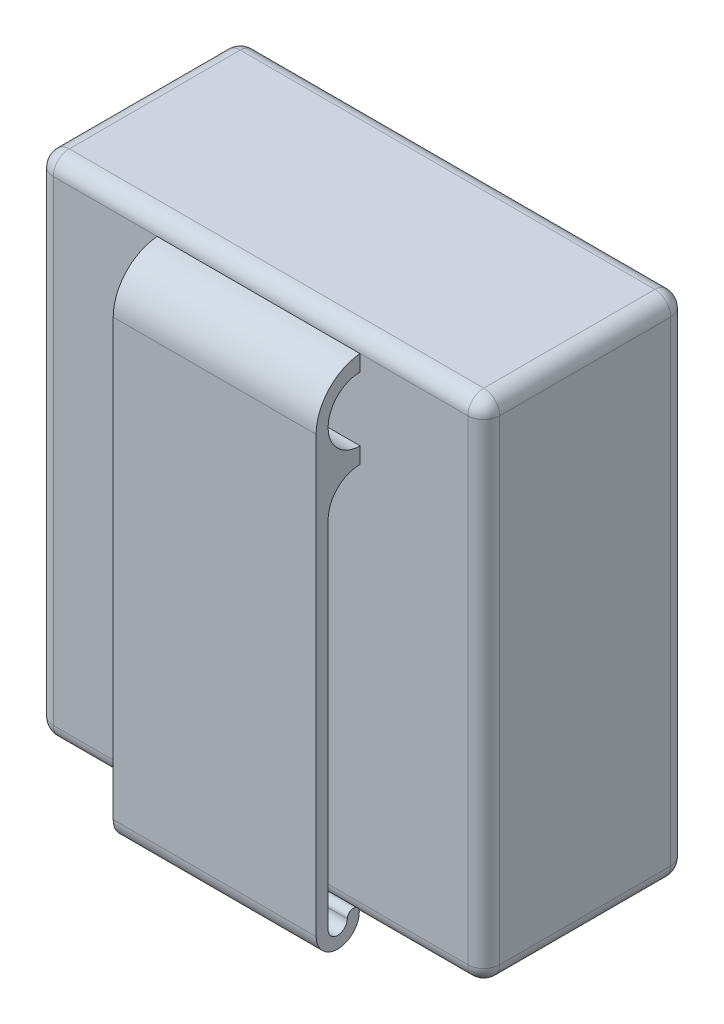
ISO-10303-21;
HEADER;
FILE_DESCRIPTION(('STEP AP214'),'2;1');
FILE_NAME('part.step','',(''),(''),'','','');
FILE_SCHEMA(('AUTOMOTIVE_DESIGN { 1 0 10303 214 1 1 1 1 }'));
ENDSEC;
DATA;
#1=APPLICATION_CONTEXT('core data for automotive mechanical design processes');
#2=APPLICATION_PROTOCOL_DEFINITION('international standard','automotive_design',2000,#1);
#3=PRODUCT_CONTEXT('',#1,'mechanical');
#4=PRODUCT('Part','Part','',(#3));
#5=PRODUCT_RELATED_PRODUCT_CATEGORY('part','',(#4));
#6=PRODUCT_DEFINITION_FORMATION('','',#4);
#7=PRODUCT_DEFINITION_CONTEXT('part definition',#1,'design');
#8=PRODUCT_DEFINITION('design','',#6,#7);
#9=PRODUCT_DEFINITION_SHAPE('','',#8);
#10=(LENGTH_UNIT() NAMED_UNIT(*) SI_UNIT(.MILLI.,.METRE.));
#11=(NAMED_UNIT(*) PLANE_ANGLE_UNIT() SI_UNIT($,.RADIAN.));
#12=(NAMED_UNIT(*) SI_UNIT($,.STERADIAN.) SOLID_ANGLE_UNIT());
#13=UNCERTAINTY_MEASURE_WITH_UNIT(LENGTH_MEASURE(1.E-05),#10,'distance_accuracy_value','');
#14=(GEOMETRIC_REPRESENTATION_CONTEXT(3) GLOBAL_UNCERTAINTY_ASSIGNED_CONTEXT((#13)) GLOBAL_UNIT_ASSIGNED_CONTEXT((#10,
#11,#12)) REPRESENTATION_CONTEXT('',''));
#15=CARTESIAN_POINT('',(0.,0.,0.));
#16=DIRECTION('',(0.,0.,1.));
#17=DIRECTION('',(1.,0.,0.));
#18=AXIS2_PLACEMENT_3D('',#15,#16,#17);
#19=CARTESIAN_POINT('',(0.,0.,25.4));
#20=DIRECTION('',(0.,0.,-1.));
#21=DIRECTION('',(-1.,0.,0.));
#22=AXIS2_PLACEMENT_3D('',#19,#20,#21);
#23=PLANE('',#22);
#24=DIRECTION('',(0.,-1.,0.));
#25=VECTOR('',#24,1.);
#26=CARTESIAN_POINT('',(40.4,61.5,25.4));
#27=LINE('',#26,#25);
#28=CARTESIAN_POINT('',(40.4,61.5,25.4));
#29=VERTEX_POINT('',#28);
#30=CARTESIAN_POINT('',(40.4,59.5,25.4));
#31=VERTEX_POINT('',#30);
#32=EDGE_CURVE('E57',#29,#31,#27,.T.);
#33=ORIENTED_EDGE('',*,*,#32,.T.);
#34=DIRECTION('',(-1.,0.,0.));
#35=VECTOR('',#34,1.);
#36=CARTESIAN_POINT('',(40.4,59.5,25.4));
#37=LINE('',#36,#35);
#38=CARTESIAN_POINT('',(15.,59.5,25.4));
#39=VERTEX_POINT('',#38);
#40=EDGE_CURVE('E203',#31,#39,#37,.T.);
#41=ORIENTED_EDGE('',*,*,#40,.T.);
#42=DIRECTION('',(0.,-1.,0.));
#43=VECTOR('',#42,1.);
#44=CARTESIAN_POINT('',(15.,61.5,25.4));
#45=LINE('',#44,#43);
#46=CARTESIAN_POINT('',(15.,61.5,25.4));
#47=VERTEX_POINT('',#46);
#48=EDGE_CURVE('E383',#47,#39,#45,.T.);
#49=ORIENTED_EDGE('',*,*,#48,.F.);
#50=DIRECTION('',(-1.,0.,0.));
#51=VECTOR('',#50,1.);
#52=CARTESIAN_POINT('',(0.,61.5,25.4));
#53=LINE('',#52,#51);
#54=CARTESIAN_POINT('',(2.,61.5,25.4));
#55=VERTEX_POINT('',#54);
#56=EDGE_CURVE('E253',#47,#55,#53,.T.);
#57=ORIENTED_EDGE('',*,*,#56,.T.);
#58=DIRECTION('',(0.,-1.,0.));
#59=VECTOR('',#58,1.);
#60=CARTESIAN_POINT('',(2.,0.,25.4));
#61=LINE('',#60,#59);
#62=CARTESIAN_POINT('',(2.,2.,25.4));
#63=VERTEX_POINT('',#62);
#64=EDGE_CURVE('E256',#55,#63,#61,.T.);
#65=ORIENTED_EDGE('',*,*,#64,.T.);
#66=DIRECTION('',(1.,0.,0.));
#67=VECTOR('',#66,1.);
#68=CARTESIAN_POINT('',(0.,2.,25.4));
#69=LINE('',#68,#67);
#70=CARTESIAN_POINT('',(53.88,2.,25.4));
#71=VERTEX_POINT('',#70);
#72=EDGE_CURVE('E258',#63,#71,#69,.T.);
#73=ORIENTED_EDGE('',*,*,#72,.T.);
#74=DIRECTION('',(0.,1.,0.));
#75=VECTOR('',#74,1.);
#76=CARTESIAN_POINT('',(53.88,0.,25.4));
#77=LINE('',#76,#75);
#78=CARTESIAN_POINT('',(53.88,61.5,25.4));
#79=VERTEX_POINT('',#78);
#80=EDGE_CURVE('E260',#71,#79,#77,.T.);
#81=ORIENTED_EDGE('',*,*,#80,.T.);
#82=EDGE_CURVE('E254',#79,#29,#53,.T.);
#83=ORIENTED_EDGE('',*,*,#82,.T.);
#84=EDGE_LOOP('',(#33,#41,#49,#57,#65,#73,#81,#83));
#85=FACE_BOUND('',#84,.T.);
#86=DIRECTION('',(0.,-1.,0.));
#87=VECTOR('',#86,1.);
#88=CARTESIAN_POINT('',(40.4,51.5,25.4));
#89=LINE('',#88,#87);
#90=CARTESIAN_POINT('',(40.4,51.5,25.4));
#91=VERTEX_POINT('',#90);
#92=CARTESIAN_POINT('',(40.4,49.5,25.4));
#93=VERTEX_POINT('',#92);
#94=EDGE_CURVE('E187',#91,#93,#89,.T.);
#95=ORIENTED_EDGE('',*,*,#94,.T.);
#96=DIRECTION('',(-1.,0.,0.));
#97=VECTOR('',#96,1.);
#98=CARTESIAN_POINT('',(40.4,49.5,25.4));
#99=LINE('',#98,#97);
#100=CARTESIAN_POINT('',(15.,49.5,25.4));
#101=VERTEX_POINT('',#100);
#102=EDGE_CURVE('E206',#93,#101,#99,.T.);
#103=ORIENTED_EDGE('',*,*,#102,.T.);
#104=DIRECTION('',(0.,-1.,0.));
#105=VECTOR('',#104,1.);
#106=CARTESIAN_POINT('',(15.,51.5,25.4));
#107=LINE('',#106,#105);
#108=CARTESIAN_POINT('',(15.,51.5,25.4));
#109=VERTEX_POINT('',#108);
#110=EDGE_CURVE('E205',#109,#101,#107,.T.);
#111=ORIENTED_EDGE('',*,*,#110,.F.);
#112=DIRECTION('',(-1.,0.,0.));
#113=VECTOR('',#112,1.);
#114=CARTESIAN_POINT('',(40.4,51.5,25.4));
#115=LINE('',#114,#113);
#116=EDGE_CURVE('E201',#91,#109,#115,.T.);
#117=ORIENTED_EDGE('',*,*,#116,.F.);
#118=EDGE_LOOP('',(#95,#103,#111,#117));
#119=FACE_BOUND('',#118,.T.);
#120=ADVANCED_FACE('F32',(#85,#119),#23,.F.);
#121=CARTESIAN_POINT('',(0.,0.,25.4));
#122=DIRECTION('',(1.,0.,0.));
#123=DIRECTION('',(0.,0.,-1.));
#124=AXIS2_PLACEMENT_3D('',#121,#122,#123);
#125=PLANE('',#124);
#126=DIRECTION('',(0.,-1.,0.));
#127=VECTOR('',#126,1.);
#128=CARTESIAN_POINT('',(0.,0.,2.));
#129=LINE('',#128,#127);
#130=CARTESIAN_POINT('',(0.,61.5,2.));
#131=VERTEX_POINT('',#130);
#132=CARTESIAN_POINT('',(0.,2.,2.));
#133=VERTEX_POINT('',#132);
#134=EDGE_CURVE('E230',#131,#133,#129,.T.);
#135=ORIENTED_EDGE('',*,*,#134,.T.);
#136=DIRECTION('',(0.,0.,-1.));
#137=VECTOR('',#136,1.);
#138=CARTESIAN_POINT('',(0.,2.,25.4));
#139=LINE('',#138,#137);
#140=CARTESIAN_POINT('',(0.,2.,23.4));
#141=VERTEX_POINT('',#140);
#142=EDGE_CURVE('E232',#133,#141,#139,.F.);
#143=ORIENTED_EDGE('',*,*,#142,.T.);
#144=DIRECTION('',(0.,-1.,0.));
#145=VECTOR('',#144,1.);
#146=CARTESIAN_POINT('',(0.,0.,23.4));
#147=LINE('',#146,#145);
#148=CARTESIAN_POINT('',(0.,61.5,23.4));
#149=VERTEX_POINT('',#148);
#150=EDGE_CURVE('E228',#141,#149,#147,.F.);
#151=ORIENTED_EDGE('',*,*,#150,.T.);
#152=DIRECTION('',(0.,0.,-1.));
#153=VECTOR('',#152,1.);
#154=CARTESIAN_POINT('',(0.,61.5,25.4));
#155=LINE('',#154,#153);
#156=EDGE_CURVE('E226',#149,#131,#155,.T.);
#157=ORIENTED_EDGE('',*,*,#156,.T.);
#158=EDGE_LOOP('',(#135,#143,#151,#157));
#159=FACE_BOUND('',#158,.T.);
#160=ADVANCED_FACE('F424',(#159),#125,.F.);
#161=CARTESIAN_POINT('',(0.,0.,25.4));
#162=DIRECTION('',(0.,1.,0.));
#163=DIRECTION('',(0.,0.,1.));
#164=AXIS2_PLACEMENT_3D('',#161,#162,#163);
#165=PLANE('',#164);
#166=DIRECTION('',(0.,0.,-1.));
#167=VECTOR('',#166,1.);
#168=CARTESIAN_POINT('',(2.,0.,25.4));
#169=LINE('',#168,#167);
#170=CARTESIAN_POINT('',(2.,0.,23.4));
#171=VERTEX_POINT('',#170);
#172=CARTESIAN_POINT('',(2.,0.,2.));
#173=VERTEX_POINT('',#172);
#174=EDGE_CURVE('E221',#171,#173,#169,.T.);
#175=ORIENTED_EDGE('',*,*,#174,.T.);
#176=DIRECTION('',(1.,0.,0.));
#177=VECTOR('',#176,1.);
#178=CARTESIAN_POINT('',(55.88,0.,2.));
#179=LINE('',#178,#177);
#180=CARTESIAN_POINT('',(53.88,0.,2.));
#181=VERTEX_POINT('',#180);
#182=EDGE_CURVE('E224',#173,#181,#179,.T.);
#183=ORIENTED_EDGE('',*,*,#182,.T.);
#184=DIRECTION('',(0.,0.,-1.));
#185=VECTOR('',#184,1.);
#186=CARTESIAN_POINT('',(53.88,0.,25.4));
#187=LINE('',#186,#185);
#188=CARTESIAN_POINT('',(53.88,0.,23.4));
#189=VERTEX_POINT('',#188);
#190=EDGE_CURVE('E219',#181,#189,#187,.F.);
#191=ORIENTED_EDGE('',*,*,#190,.T.);
#192=DIRECTION('',(1.,0.,0.));
#193=VECTOR('',#192,1.);
#194=CARTESIAN_POINT('',(0.,0.,23.4));
#195=LINE('',#194,#193);
#196=EDGE_CURVE('E217',#189,#171,#195,.F.);
#197=ORIENTED_EDGE('',*,*,#196,.T.);
#198=EDGE_LOOP('',(#175,#183,#191,#197));
#199=FACE_BOUND('',#198,.T.);
#200=ADVANCED_FACE('F429',(#199),#165,.F.);
#201=CARTESIAN_POINT('',(55.88,0.,25.4));
#202=DIRECTION('',(-1.,0.,0.));
#203=DIRECTION('',(0.,0.,1.));
#204=AXIS2_PLACEMENT_3D('',#201,#202,#203);
#205=PLANE('',#204);
#206=DIRECTION('',(0.,1.,0.));
#207=VECTOR('',#206,1.);
#208=CARTESIAN_POINT('',(55.88,0.,23.4));
#209=LINE('',#208,#207);
#210=CARTESIAN_POINT('',(55.88,61.5,23.4));
#211=VERTEX_POINT('',#210);
#212=CARTESIAN_POINT('',(55.88,2.,23.4));
#213=VERTEX_POINT('',#212);
#214=EDGE_CURVE('E237',#211,#213,#209,.F.);
#215=ORIENTED_EDGE('',*,*,#214,.T.);
#216=DIRECTION('',(0.,0.,-1.));
#217=VECTOR('',#216,1.);
#218=CARTESIAN_POINT('',(55.88,2.,25.4));
#219=LINE('',#218,#217);
#220=CARTESIAN_POINT('',(55.88,2.,2.));
#221=VERTEX_POINT('',#220);
#222=EDGE_CURVE('E241',#213,#221,#219,.T.);
#223=ORIENTED_EDGE('',*,*,#222,.T.);
#224=DIRECTION('',(0.,1.,0.));
#225=VECTOR('',#224,1.);
#226=CARTESIAN_POINT('',(55.88,63.5,2.));
#227=LINE('',#226,#225);
#228=CARTESIAN_POINT('',(55.88,61.5,2.));
#229=VERTEX_POINT('',#228);
#230=EDGE_CURVE('E239',#221,#229,#227,.T.);
#231=ORIENTED_EDGE('',*,*,#230,.T.);
#232=DIRECTION('',(0.,0.,-1.));
#233=VECTOR('',#232,1.);
#234=CARTESIAN_POINT('',(55.88,61.5,25.4));
#235=LINE('',#234,#233);
#236=EDGE_CURVE('E235',#229,#211,#235,.F.);
#237=ORIENTED_EDGE('',*,*,#236,.T.);
#238=EDGE_LOOP('',(#215,#223,#231,#237));
#239=FACE_BOUND('',#238,.T.);
#240=ADVANCED_FACE('F442',(#239),#205,.F.);
#241=CARTESIAN_POINT('',(0.,63.5,25.4));
#242=DIRECTION('',(0.,-1.,0.));
#243=DIRECTION('',(0.,0.,-1.));
#244=AXIS2_PLACEMENT_3D('',#241,#242,#243);
#245=PLANE('',#244);
#246=DIRECTION('',(-1.,0.,0.));
#247=VECTOR('',#246,1.);
#248=CARTESIAN_POINT('',(0.,63.5,23.4));
#249=LINE('',#248,#247);
#250=CARTESIAN_POINT('',(2.,63.5,23.4));
#251=VERTEX_POINT('',#250);
#252=CARTESIAN_POINT('',(53.88,63.5,23.4));
#253=VERTEX_POINT('',#252);
#254=EDGE_CURVE('E41',#251,#253,#249,.F.);
#255=ORIENTED_EDGE('',*,*,#254,.T.);
#256=DIRECTION('',(0.,0.,-1.));
#257=VECTOR('',#256,1.);
#258=CARTESIAN_POINT('',(53.88,63.5,25.4));
#259=LINE('',#258,#257);
#260=CARTESIAN_POINT('',(53.88,63.5,2.));
#261=VERTEX_POINT('',#260);
#262=EDGE_CURVE('E11',#253,#261,#259,.T.);
#263=ORIENTED_EDGE('',*,*,#262,.T.);
#264=DIRECTION('',(-1.,0.,0.));
#265=VECTOR('',#264,1.);
#266=CARTESIAN_POINT('',(0.,63.5,2.));
#267=LINE('',#266,#265);
#268=CARTESIAN_POINT('',(2.,63.5,2.));
#269=VERTEX_POINT('',#268);
#270=EDGE_CURVE('E263',#261,#269,#267,.T.);
#271=ORIENTED_EDGE('',*,*,#270,.T.);
#272=DIRECTION('',(0.,0.,-1.));
#273=VECTOR('',#272,1.);
#274=CARTESIAN_POINT('',(2.,63.5,25.4));
#275=LINE('',#274,#273);
#276=EDGE_CURVE('E265',#269,#251,#275,.F.);
#277=ORIENTED_EDGE('',*,*,#276,.T.);
#278=EDGE_LOOP('',(#255,#263,#271,#277));
#279=FACE_BOUND('',#278,.T.);
#280=ADVANCED_FACE('F438',(#279),#245,.F.);
#281=CARTESIAN_POINT('',(0.,0.,0.));
#282=DIRECTION('',(0.,0.,-1.));
#283=DIRECTION('',(-1.,0.,0.));
#284=AXIS2_PLACEMENT_3D('',#281,#282,#283);
#285=PLANE('',#284);
#286=DIRECTION('',(0.,1.,0.));
#287=VECTOR('',#286,1.);
#288=CARTESIAN_POINT('',(53.88,0.,0.));
#289=LINE('',#288,#287);
#290=CARTESIAN_POINT('',(53.88,61.5,0.));
#291=VERTEX_POINT('',#290);
#292=CARTESIAN_POINT('',(53.88,2.,0.));
#293=VERTEX_POINT('',#292);
#294=EDGE_CURVE('E248',#291,#293,#289,.F.);
#295=ORIENTED_EDGE('',*,*,#294,.T.);
#296=DIRECTION('',(1.,0.,0.));
#297=VECTOR('',#296,1.);
#298=CARTESIAN_POINT('',(0.,2.,0.));
#299=LINE('',#298,#297);
#300=CARTESIAN_POINT('',(2.,2.,0.));
#301=VERTEX_POINT('',#300);
#302=EDGE_CURVE('E250',#293,#301,#299,.F.);
#303=ORIENTED_EDGE('',*,*,#302,.T.);
#304=DIRECTION('',(0.,-1.,0.));
#305=VECTOR('',#304,1.);
#306=CARTESIAN_POINT('',(2.,63.5,0.));
#307=LINE('',#306,#305);
#308=CARTESIAN_POINT('',(2.,61.5,0.));
#309=VERTEX_POINT('',#308);
#310=EDGE_CURVE('E246',#301,#309,#307,.F.);
#311=ORIENTED_EDGE('',*,*,#310,.T.);
#312=DIRECTION('',(-1.,0.,0.));
#313=VECTOR('',#312,1.);
#314=CARTESIAN_POINT('',(55.88,61.5,0.));
#315=LINE('',#314,#313);
#316=EDGE_CURVE('E244',#309,#291,#315,.F.);
#317=ORIENTED_EDGE('',*,*,#316,.T.);
#318=EDGE_LOOP('',(#295,#303,#311,#317));
#319=FACE_BOUND('',#318,.T.);
#320=ADVANCED_FACE('F435',(#319),#285,.T.);
#321=CARTESIAN_POINT('',(53.88,61.5,25.4));
#322=DIRECTION('',(0.,0.,-1.));
#323=DIRECTION('',(-1.,0.,0.));
#324=AXIS2_PLACEMENT_3D('',#321,#322,#323);
#325=CYLINDRICAL_SURFACE('',#324,2.);
#326=CARTESIAN_POINT('',(53.88,61.5,23.4));
#327=DIRECTION('',(0.,0.,1.));
#328=DIRECTION('',(1.,0.,0.));
#329=AXIS2_PLACEMENT_3D('',#326,#327,#328);
#330=CIRCLE('',#329,2.);
#331=EDGE_CURVE('E36',#211,#253,#330,.T.);
#332=ORIENTED_EDGE('',*,*,#331,.F.);
#333=ORIENTED_EDGE('',*,*,#236,.F.);
#334=CARTESIAN_POINT('',(53.88,61.5,2.));
#335=DIRECTION('',(0.,0.,-1.));
#336=DIRECTION('',(-1.,0.,0.));
#337=AXIS2_PLACEMENT_3D('',#334,#335,#336);
#338=CIRCLE('',#337,2.);
#339=EDGE_CURVE('E330',#261,#229,#338,.T.);
#340=ORIENTED_EDGE('',*,*,#339,.F.);
#341=ORIENTED_EDGE('',*,*,#262,.F.);
#342=EDGE_LOOP('',(#332,#333,#340,#341));
#343=FACE_BOUND('',#342,.T.);
#344=ADVANCED_FACE('F34',(#343),#325,.T.);
#345=CARTESIAN_POINT('',(53.88,61.5,23.4));
#346=DIRECTION('',(0.,0.,1.));
#347=DIRECTION('',(1.,0.,0.));
#348=AXIS2_PLACEMENT_3D('',#345,#346,#347);
#349=SPHERICAL_SURFACE('',#348,2.);
#350=CARTESIAN_POINT('',(53.88,61.5,23.4));
#351=DIRECTION('',(0.,1.,0.));
#352=DIRECTION('',(0.,0.,1.));
#353=AXIS2_PLACEMENT_3D('',#350,#351,#352);
#354=CIRCLE('',#353,2.);
#355=EDGE_CURVE('E325',#211,#79,#354,.F.);
#356=ORIENTED_EDGE('',*,*,#355,.F.);
#357=ORIENTED_EDGE('',*,*,#331,.T.);
#358=CARTESIAN_POINT('',(53.88,61.5,23.4));
#359=DIRECTION('',(1.,0.,0.));
#360=DIRECTION('',(0.,0.,-1.));
#361=AXIS2_PLACEMENT_3D('',#358,#359,#360);
#362=CIRCLE('',#361,2.);
#363=EDGE_CURVE('E328',#79,#253,#362,.F.);
#364=ORIENTED_EDGE('',*,*,#363,.F.);
#365=EDGE_LOOP('',(#356,#357,#364));
#366=FACE_BOUND('',#365,.T.);
#367=ADVANCED_FACE('F341',(#366),#349,.T.);
#368=CARTESIAN_POINT('',(53.88,61.5,2.));
#369=DIRECTION('',(0.,0.,1.));
#370=DIRECTION('',(1.,0.,0.));
#371=AXIS2_PLACEMENT_3D('',#368,#369,#370);
#372=SPHERICAL_SURFACE('',#371,2.);
#373=CARTESIAN_POINT('',(53.88,61.5,2.));
#374=DIRECTION('',(1.,0.,0.));
#375=DIRECTION('',(0.,0.,-1.));
#376=AXIS2_PLACEMENT_3D('',#373,#374,#375);
#377=CIRCLE('',#376,2.);
#378=EDGE_CURVE('E319',#261,#291,#377,.F.);
#379=ORIENTED_EDGE('',*,*,#378,.F.);
#380=ORIENTED_EDGE('',*,*,#339,.T.);
#381=CARTESIAN_POINT('',(53.88,61.5,2.));
#382=DIRECTION('',(0.,1.,0.));
#383=DIRECTION('',(0.,0.,1.));
#384=AXIS2_PLACEMENT_3D('',#381,#382,#383);
#385=CIRCLE('',#384,2.);
#386=EDGE_CURVE('E322',#291,#229,#385,.F.);
#387=ORIENTED_EDGE('',*,*,#386,.F.);
#388=EDGE_LOOP('',(#379,#380,#387));
#389=FACE_BOUND('',#388,.T.);
#390=ADVANCED_FACE('F516',(#389),#372,.T.);
#391=CARTESIAN_POINT('',(0.,61.5,23.4));
#392=DIRECTION('',(-1.,0.,0.));
#393=DIRECTION('',(0.,0.,1.));
#394=AXIS2_PLACEMENT_3D('',#391,#392,#393);
#395=CYLINDRICAL_SURFACE('',#394,2.);
#396=ORIENTED_EDGE('',*,*,#363,.T.);
#397=ORIENTED_EDGE('',*,*,#254,.F.);
#398=CARTESIAN_POINT('',(2.,61.5,23.4));
#399=DIRECTION('',(-1.,0.,0.));
#400=DIRECTION('',(0.,0.,1.));
#401=AXIS2_PLACEMENT_3D('',#398,#399,#400);
#402=CIRCLE('',#401,2.);
#403=EDGE_CURVE('E313',#55,#251,#402,.T.);
#404=ORIENTED_EDGE('',*,*,#403,.F.);
#405=ORIENTED_EDGE('',*,*,#56,.F.);
#406=DIRECTION('',(-1.,0.,0.));
#407=VECTOR('',#406,1.);
#408=CARTESIAN_POINT('',(40.4,61.5,25.4));
#409=LINE('',#408,#407);
#410=EDGE_CURVE('E210',#29,#47,#409,.T.);
#411=ORIENTED_EDGE('',*,*,#410,.F.);
#412=ORIENTED_EDGE('',*,*,#82,.F.);
#413=EDGE_LOOP('',(#396,#397,#404,#405,#411,#412));
#414=FACE_BOUND('',#413,.T.);
#415=ADVANCED_FACE('F348',(#414),#395,.T.);
#416=CARTESIAN_POINT('',(53.88,0.,23.4));
#417=DIRECTION('',(0.,1.,0.));
#418=DIRECTION('',(0.,0.,1.));
#419=AXIS2_PLACEMENT_3D('',#416,#417,#418);
#420=CYLINDRICAL_SURFACE('',#419,2.);
#421=ORIENTED_EDGE('',*,*,#355,.T.);
#422=ORIENTED_EDGE('',*,*,#80,.F.);
#423=CARTESIAN_POINT('',(53.88,2.,23.4));
#424=DIRECTION('',(0.,-1.,0.));
#425=DIRECTION('',(0.,0.,-1.));
#426=AXIS2_PLACEMENT_3D('',#423,#424,#425);
#427=CIRCLE('',#426,2.);
#428=EDGE_CURVE('E310',#213,#71,#427,.T.);
#429=ORIENTED_EDGE('',*,*,#428,.F.);
#430=ORIENTED_EDGE('',*,*,#214,.F.);
#431=EDGE_LOOP('',(#421,#422,#429,#430));
#432=FACE_BOUND('',#431,.T.);
#433=ADVANCED_FACE('F509',(#432),#420,.T.);
#434=CARTESIAN_POINT('',(53.88,2.,25.4));
#435=DIRECTION('',(0.,0.,-1.));
#436=DIRECTION('',(-1.,0.,0.));
#437=AXIS2_PLACEMENT_3D('',#434,#435,#436);
#438=CYLINDRICAL_SURFACE('',#437,2.);
#439=CARTESIAN_POINT('',(53.88,2.,2.));
#440=DIRECTION('',(0.,0.,-1.));
#441=DIRECTION('',(-1.,0.,0.));
#442=AXIS2_PLACEMENT_3D('',#439,#440,#441);
#443=CIRCLE('',#442,2.);
#444=EDGE_CURVE('E304',#221,#181,#443,.T.);
#445=ORIENTED_EDGE('',*,*,#444,.F.);
#446=ORIENTED_EDGE('',*,*,#222,.F.);
#447=CARTESIAN_POINT('',(53.88,2.,23.4));
#448=DIRECTION('',(0.,0.,1.));
#449=DIRECTION('',(1.,0.,0.));
#450=AXIS2_PLACEMENT_3D('',#447,#448,#449);
#451=CIRCLE('',#450,2.);
#452=EDGE_CURVE('E307',#189,#213,#451,.T.);
#453=ORIENTED_EDGE('',*,*,#452,.F.);
#454=ORIENTED_EDGE('',*,*,#190,.F.);
#455=EDGE_LOOP('',(#445,#446,#453,#454));
#456=FACE_BOUND('',#455,.T.);
#457=ADVANCED_FACE('F505',(#456),#438,.T.);
#458=CARTESIAN_POINT('',(53.88,0.,2.));
#459=DIRECTION('',(0.,-1.,0.));
#460=DIRECTION('',(0.,0.,-1.));
#461=AXIS2_PLACEMENT_3D('',#458,#459,#460);
#462=CYLINDRICAL_SURFACE('',#461,2.);
#463=ORIENTED_EDGE('',*,*,#386,.T.);
#464=ORIENTED_EDGE('',*,*,#230,.F.);
#465=CARTESIAN_POINT('',(53.88,2.,2.));
#466=DIRECTION('',(0.,-1.,0.));
#467=DIRECTION('',(0.,0.,-1.));
#468=AXIS2_PLACEMENT_3D('',#465,#466,#467);
#469=CIRCLE('',#468,2.);
#470=EDGE_CURVE('E302',#293,#221,#469,.T.);
#471=ORIENTED_EDGE('',*,*,#470,.F.);
#472=ORIENTED_EDGE('',*,*,#294,.F.);
#473=EDGE_LOOP('',(#463,#464,#471,#472));
#474=FACE_BOUND('',#473,.T.);
#475=ADVANCED_FACE('F501',(#474),#462,.T.);
#476=CARTESIAN_POINT('',(0.,61.5,2.));
#477=DIRECTION('',(1.,0.,0.));
#478=DIRECTION('',(0.,0.,-1.));
#479=AXIS2_PLACEMENT_3D('',#476,#477,#478);
#480=CYLINDRICAL_SURFACE('',#479,2.);
#481=ORIENTED_EDGE('',*,*,#378,.T.);
#482=ORIENTED_EDGE('',*,*,#316,.F.);
#483=CARTESIAN_POINT('',(2.,61.5,2.));
#484=DIRECTION('',(-1.,0.,0.));
#485=DIRECTION('',(0.,0.,1.));
#486=AXIS2_PLACEMENT_3D('',#483,#484,#485);
#487=CIRCLE('',#486,2.);
#488=EDGE_CURVE('E299',#269,#309,#487,.T.);
#489=ORIENTED_EDGE('',*,*,#488,.F.);
#490=ORIENTED_EDGE('',*,*,#270,.F.);
#491=EDGE_LOOP('',(#481,#482,#489,#490));
#492=FACE_BOUND('',#491,.T.);
#493=ADVANCED_FACE('F497',(#492),#480,.T.);
#494=CARTESIAN_POINT('',(2.,61.5,25.4));
#495=DIRECTION('',(0.,0.,-1.));
#496=DIRECTION('',(-1.,0.,0.));
#497=AXIS2_PLACEMENT_3D('',#494,#495,#496);
#498=CYLINDRICAL_SURFACE('',#497,2.);
#499=CARTESIAN_POINT('',(2.,61.5,23.4));
#500=DIRECTION('',(0.,0.,1.));
#501=DIRECTION('',(1.,0.,0.));
#502=AXIS2_PLACEMENT_3D('',#499,#500,#501);
#503=CIRCLE('',#502,2.);
#504=EDGE_CURVE('E316',#251,#149,#503,.T.);
#505=ORIENTED_EDGE('',*,*,#504,.F.);
#506=ORIENTED_EDGE('',*,*,#276,.F.);
#507=CARTESIAN_POINT('',(2.,61.5,2.));
#508=DIRECTION('',(0.,0.,-1.));
#509=DIRECTION('',(-1.,0.,0.));
#510=AXIS2_PLACEMENT_3D('',#507,#508,#509);
#511=CIRCLE('',#510,2.);
#512=EDGE_CURVE('E296',#131,#269,#511,.T.);
#513=ORIENTED_EDGE('',*,*,#512,.F.);
#514=ORIENTED_EDGE('',*,*,#156,.F.);
#515=EDGE_LOOP('',(#505,#506,#513,#514));
#516=FACE_BOUND('',#515,.T.);
#517=ADVANCED_FACE('F493',(#516),#498,.T.);
#518=CARTESIAN_POINT('',(2.,61.5,23.4));
#519=DIRECTION('',(0.,0.,1.));
#520=DIRECTION('',(1.,0.,0.));
#521=AXIS2_PLACEMENT_3D('',#518,#519,#520);
#522=SPHERICAL_SURFACE('',#521,2.);
#523=ORIENTED_EDGE('',*,*,#403,.T.);
#524=ORIENTED_EDGE('',*,*,#504,.T.);
#525=CARTESIAN_POINT('',(2.,61.5,23.4));
#526=DIRECTION('',(0.,1.,0.));
#527=DIRECTION('',(0.,0.,1.));
#528=AXIS2_PLACEMENT_3D('',#525,#526,#527);
#529=CIRCLE('',#528,2.);
#530=EDGE_CURVE('E293',#55,#149,#529,.F.);
#531=ORIENTED_EDGE('',*,*,#530,.F.);
#532=EDGE_LOOP('',(#523,#524,#531));
#533=FACE_BOUND('',#532,.T.);
#534=ADVANCED_FACE('F489',(#533),#522,.T.);
#535=CARTESIAN_POINT('',(53.88,2.,23.4));
#536=DIRECTION('',(0.,0.,1.));
#537=DIRECTION('',(1.,0.,0.));
#538=AXIS2_PLACEMENT_3D('',#535,#536,#537);
#539=SPHERICAL_SURFACE('',#538,2.);
#540=ORIENTED_EDGE('',*,*,#452,.T.);
#541=ORIENTED_EDGE('',*,*,#428,.T.);
#542=CARTESIAN_POINT('',(53.88,2.,23.4));
#543=DIRECTION('',(1.,0.,0.));
#544=DIRECTION('',(0.,0.,-1.));
#545=AXIS2_PLACEMENT_3D('',#542,#543,#544);
#546=CIRCLE('',#545,2.);
#547=EDGE_CURVE('E290',#189,#71,#546,.F.);
#548=ORIENTED_EDGE('',*,*,#547,.F.);
#549=EDGE_LOOP('',(#540,#541,#548));
#550=FACE_BOUND('',#549,.T.);
#551=ADVANCED_FACE('F485',(#550),#539,.T.);
#552=CARTESIAN_POINT('',(53.88,2.,2.));
#553=DIRECTION('',(0.,0.,1.));
#554=DIRECTION('',(1.,0.,0.));
#555=AXIS2_PLACEMENT_3D('',#552,#553,#554);
#556=SPHERICAL_SURFACE('',#555,2.);
#557=ORIENTED_EDGE('',*,*,#470,.T.);
#558=ORIENTED_EDGE('',*,*,#444,.T.);
#559=CARTESIAN_POINT('',(53.88,2.,2.));
#560=DIRECTION('',(1.,0.,0.));
#561=DIRECTION('',(0.,0.,-1.));
#562=AXIS2_PLACEMENT_3D('',#559,#560,#561);
#563=CIRCLE('',#562,2.);
#564=EDGE_CURVE('E287',#293,#181,#563,.F.);
#565=ORIENTED_EDGE('',*,*,#564,.F.);
#566=EDGE_LOOP('',(#557,#558,#565));
#567=FACE_BOUND('',#566,.T.);
#568=ADVANCED_FACE('F481',(#567),#556,.T.);
#569=CARTESIAN_POINT('',(2.,61.5,2.));
#570=DIRECTION('',(0.,0.,1.));
#571=DIRECTION('',(1.,0.,0.));
#572=AXIS2_PLACEMENT_3D('',#569,#570,#571);
#573=SPHERICAL_SURFACE('',#572,2.);
#574=ORIENTED_EDGE('',*,*,#512,.T.);
#575=ORIENTED_EDGE('',*,*,#488,.T.);
#576=CARTESIAN_POINT('',(2.,61.5,2.));
#577=DIRECTION('',(0.,1.,0.));
#578=DIRECTION('',(0.,0.,1.));
#579=AXIS2_PLACEMENT_3D('',#576,#577,#578);
#580=CIRCLE('',#579,2.);
#581=EDGE_CURVE('E284',#131,#309,#580,.F.);
#582=ORIENTED_EDGE('',*,*,#581,.F.);
#583=EDGE_LOOP('',(#574,#575,#582));
#584=FACE_BOUND('',#583,.T.);
#585=ADVANCED_FACE('F477',(#584),#573,.T.);
#586=CARTESIAN_POINT('',(2.,0.,23.4));
#587=DIRECTION('',(0.,-1.,0.));
#588=DIRECTION('',(0.,0.,-1.));
#589=AXIS2_PLACEMENT_3D('',#586,#587,#588);
#590=CYLINDRICAL_SURFACE('',#589,2.);
#591=ORIENTED_EDGE('',*,*,#530,.T.);
#592=ORIENTED_EDGE('',*,*,#150,.F.);
#593=CARTESIAN_POINT('',(2.,2.,23.4));
#594=DIRECTION('',(0.,-1.,0.));
#595=DIRECTION('',(0.,0.,-1.));
#596=AXIS2_PLACEMENT_3D('',#593,#594,#595);
#597=CIRCLE('',#596,2.);
#598=EDGE_CURVE('E281',#63,#141,#597,.T.);
#599=ORIENTED_EDGE('',*,*,#598,.F.);
#600=ORIENTED_EDGE('',*,*,#64,.F.);
#601=EDGE_LOOP('',(#591,#592,#599,#600));
#602=FACE_BOUND('',#601,.T.);
#603=ADVANCED_FACE('F473',(#602),#590,.T.);
#604=CARTESIAN_POINT('',(0.,2.,23.4));
#605=DIRECTION('',(1.,0.,0.));
#606=DIRECTION('',(0.,0.,-1.));
#607=AXIS2_PLACEMENT_3D('',#604,#605,#606);
#608=CYLINDRICAL_SURFACE('',#607,2.);
#609=ORIENTED_EDGE('',*,*,#547,.T.);
#610=ORIENTED_EDGE('',*,*,#72,.F.);
#611=CARTESIAN_POINT('',(2.,2.,23.4));
#612=DIRECTION('',(-1.,0.,0.));
#613=DIRECTION('',(0.,0.,1.));
#614=AXIS2_PLACEMENT_3D('',#611,#612,#613);
#615=CIRCLE('',#614,2.);
#616=EDGE_CURVE('E278',#171,#63,#615,.T.);
#617=ORIENTED_EDGE('',*,*,#616,.F.);
#618=ORIENTED_EDGE('',*,*,#196,.F.);
#619=EDGE_LOOP('',(#609,#610,#617,#618));
#620=FACE_BOUND('',#619,.T.);
#621=ADVANCED_FACE('F469',(#620),#608,.T.);
#622=CARTESIAN_POINT('',(0.,2.,2.));
#623=DIRECTION('',(-1.,0.,0.));
#624=DIRECTION('',(0.,0.,1.));
#625=AXIS2_PLACEMENT_3D('',#622,#623,#624);
#626=CYLINDRICAL_SURFACE('',#625,2.);
#627=ORIENTED_EDGE('',*,*,#564,.T.);
#628=ORIENTED_EDGE('',*,*,#182,.F.);
#629=CARTESIAN_POINT('',(2.,2.,2.));
#630=DIRECTION('',(-1.,0.,0.));
#631=DIRECTION('',(0.,0.,1.));
#632=AXIS2_PLACEMENT_3D('',#629,#630,#631);
#633=CIRCLE('',#632,2.);
#634=EDGE_CURVE('E275',#301,#173,#633,.T.);
#635=ORIENTED_EDGE('',*,*,#634,.F.);
#636=ORIENTED_EDGE('',*,*,#302,.F.);
#637=EDGE_LOOP('',(#627,#628,#635,#636));
#638=FACE_BOUND('',#637,.T.);
#639=ADVANCED_FACE('F465',(#638),#626,.T.);
#640=CARTESIAN_POINT('',(2.,0.,2.));
#641=DIRECTION('',(0.,1.,0.));
#642=DIRECTION('',(0.,0.,1.));
#643=AXIS2_PLACEMENT_3D('',#640,#641,#642);
#644=CYLINDRICAL_SURFACE('',#643,2.);
#645=ORIENTED_EDGE('',*,*,#581,.T.);
#646=ORIENTED_EDGE('',*,*,#310,.F.);
#647=CARTESIAN_POINT('',(2.,2.,2.));
#648=DIRECTION('',(0.,-1.,0.));
#649=DIRECTION('',(0.,0.,-1.));
#650=AXIS2_PLACEMENT_3D('',#647,#648,#649);
#651=CIRCLE('',#650,2.);
#652=EDGE_CURVE('E273',#133,#301,#651,.T.);
#653=ORIENTED_EDGE('',*,*,#652,.F.);
#654=ORIENTED_EDGE('',*,*,#134,.F.);
#655=EDGE_LOOP('',(#645,#646,#653,#654));
#656=FACE_BOUND('',#655,.T.);
#657=ADVANCED_FACE('F461',(#656),#644,.T.);
#658=CARTESIAN_POINT('',(2.,2.,23.4));
#659=DIRECTION('',(0.,0.,1.));
#660=DIRECTION('',(1.,0.,0.));
#661=AXIS2_PLACEMENT_3D('',#658,#659,#660);
#662=SPHERICAL_SURFACE('',#661,2.);
#663=ORIENTED_EDGE('',*,*,#616,.T.);
#664=ORIENTED_EDGE('',*,*,#598,.T.);
#665=CARTESIAN_POINT('',(2.,2.,23.4));
#666=DIRECTION('',(0.,0.,1.));
#667=DIRECTION('',(1.,0.,0.));
#668=AXIS2_PLACEMENT_3D('',#665,#666,#667);
#669=CIRCLE('',#668,2.);
#670=EDGE_CURVE('E270',#171,#141,#669,.F.);
#671=ORIENTED_EDGE('',*,*,#670,.F.);
#672=EDGE_LOOP('',(#663,#664,#671));
#673=FACE_BOUND('',#672,.T.);
#674=ADVANCED_FACE('F457',(#673),#662,.T.);
#675=CARTESIAN_POINT('',(2.,2.,2.));
#676=DIRECTION('',(0.,0.,1.));
#677=DIRECTION('',(1.,0.,0.));
#678=AXIS2_PLACEMENT_3D('',#675,#676,#677);
#679=SPHERICAL_SURFACE('',#678,2.);
#680=ORIENTED_EDGE('',*,*,#652,.T.);
#681=ORIENTED_EDGE('',*,*,#634,.T.);
#682=CARTESIAN_POINT('',(2.,2.,2.));
#683=DIRECTION('',(0.,0.,-1.));
#684=DIRECTION('',(-1.,0.,0.));
#685=AXIS2_PLACEMENT_3D('',#682,#683,#684);
#686=CIRCLE('',#685,2.);
#687=EDGE_CURVE('E268',#133,#173,#686,.F.);
#688=ORIENTED_EDGE('',*,*,#687,.F.);
#689=EDGE_LOOP('',(#680,#681,#688));
#690=FACE_BOUND('',#689,.T.);
#691=ADVANCED_FACE('F453',(#690),#679,.T.);
#692=CARTESIAN_POINT('',(2.,2.,25.4));
#693=DIRECTION('',(0.,0.,-1.));
#694=DIRECTION('',(-1.,0.,0.));
#695=AXIS2_PLACEMENT_3D('',#692,#693,#694);
#696=CYLINDRICAL_SURFACE('',#695,2.);
#697=ORIENTED_EDGE('',*,*,#670,.T.);
#698=ORIENTED_EDGE('',*,*,#142,.F.);
#699=ORIENTED_EDGE('',*,*,#687,.T.);
#700=ORIENTED_EDGE('',*,*,#174,.F.);
#701=EDGE_LOOP('',(#697,#698,#699,#700));
#702=FACE_BOUND('',#701,.T.);
#703=ADVANCED_FACE('F450',(#702),#696,.T.);
#704=CARTESIAN_POINT('',(40.4,55.5,24.8772727272727));
#705=DIRECTION('',(-1.,0.,0.));
#706=DIRECTION('',(0.,0.,1.));
#707=AXIS2_PLACEMENT_3D('',#704,#705,#706);
#708=CYLINDRICAL_SURFACE('',#707,6.02272727272728);
#709=CARTESIAN_POINT('',(15.,55.5,24.8772727272727));
#710=DIRECTION('',(-1.,0.,0.));
#711=DIRECTION('',(0.,0.,1.));
#712=AXIS2_PLACEMENT_3D('',#709,#710,#711);
#713=CIRCLE('',#712,6.02272727272728);
#714=CARTESIAN_POINT('',(15.,55.5,30.9));
#715=VERTEX_POINT('',#714);
#716=EDGE_CURVE('E381',#715,#47,#713,.T.);
#717=ORIENTED_EDGE('',*,*,#716,.F.);
#718=DIRECTION('',(-1.,0.,0.));
#719=VECTOR('',#718,1.);
#720=CARTESIAN_POINT('',(40.4,55.5,30.9));
#721=LINE('',#720,#719);
#722=CARTESIAN_POINT('',(40.4,55.5,30.9));
#723=VERTEX_POINT('',#722);
#724=EDGE_CURVE('E271',#723,#715,#721,.T.);
#725=ORIENTED_EDGE('',*,*,#724,.F.);
#726=CARTESIAN_POINT('',(40.4,55.5,24.8772727272727));
#727=DIRECTION('',(-1.,0.,0.));
#728=DIRECTION('',(0.,0.,1.));
#729=AXIS2_PLACEMENT_3D('',#726,#727,#728);
#730=CIRCLE('',#729,6.02272727272728);
#731=EDGE_CURVE('E354',#723,#29,#730,.T.);
#732=ORIENTED_EDGE('',*,*,#731,.T.);
#733=ORIENTED_EDGE('',*,*,#410,.T.);
#734=EDGE_LOOP('',(#717,#725,#732,#733));
#735=FACE_BOUND('',#734,.T.);
#736=ADVANCED_FACE('F359',(#735),#708,.T.);
#737=CARTESIAN_POINT('',(40.4,1.04999999999999,30.9));
#738=DIRECTION('',(0.,0.,1.));
#739=DIRECTION('',(0.,-1.,0.));
#740=AXIS2_PLACEMENT_3D('',#737,#738,#739);
#741=PLANE('',#740);
#742=DIRECTION('',(0.,1.,0.));
#743=VECTOR('',#742,1.);
#744=CARTESIAN_POINT('',(15.,1.04999999999999,30.9));
#745=LINE('',#744,#743);
#746=CARTESIAN_POINT('',(15.,1.04999999999999,30.9));
#747=VERTEX_POINT('',#746);
#748=EDGE_CURVE('E361',#747,#715,#745,.T.);
#749=ORIENTED_EDGE('',*,*,#748,.F.);
#750=DIRECTION('',(-1.,0.,0.));
#751=VECTOR('',#750,1.);
#752=CARTESIAN_POINT('',(40.4,1.04999999999999,30.9));
#753=LINE('',#752,#751);
#754=CARTESIAN_POINT('',(40.4,1.04999999999999,30.9));
#755=VERTEX_POINT('',#754);
#756=EDGE_CURVE('E402',#755,#747,#753,.T.);
#757=ORIENTED_EDGE('',*,*,#756,.F.);
#758=DIRECTION('',(0.,1.,0.));
#759=VECTOR('',#758,1.);
#760=CARTESIAN_POINT('',(40.4,1.04999999999999,30.9));
#761=LINE('',#760,#759);
#762=EDGE_CURVE('E216',#755,#723,#761,.T.);
#763=ORIENTED_EDGE('',*,*,#762,.T.);
#764=ORIENTED_EDGE('',*,*,#724,.T.);
#765=EDGE_LOOP('',(#749,#757,#763,#764));
#766=FACE_BOUND('',#765,.T.);
#767=ADVANCED_FACE('F662',(#766),#741,.T.);
#768=CARTESIAN_POINT('',(40.4,1.04999999999999,28.2));
#769=DIRECTION('',(-1.,0.,0.));
#770=DIRECTION('',(0.,0.,1.));
#771=AXIS2_PLACEMENT_3D('',#768,#769,#770);
#772=CYLINDRICAL_SURFACE('',#771,2.7);
#773=CARTESIAN_POINT('',(15.,1.04999999999999,28.2));
#774=DIRECTION('',(-1.,0.,0.));
#775=DIRECTION('',(0.,0.,1.));
#776=AXIS2_PLACEMENT_3D('',#773,#774,#775);
#777=CIRCLE('',#776,2.7);
#778=CARTESIAN_POINT('',(15.,1.04999999999999,25.5));
#779=VERTEX_POINT('',#778);
#780=EDGE_CURVE('E364',#779,#747,#777,.T.);
#781=ORIENTED_EDGE('',*,*,#780,.F.);
#782=DIRECTION('',(-1.,0.,0.));
#783=VECTOR('',#782,1.);
#784=CARTESIAN_POINT('',(40.4,1.04999999999999,25.5));
#785=LINE('',#784,#783);
#786=CARTESIAN_POINT('',(40.4,1.04999999999999,25.5));
#787=VERTEX_POINT('',#786);
#788=EDGE_CURVE('E404',#787,#779,#785,.T.);
#789=ORIENTED_EDGE('',*,*,#788,.F.);
#790=CARTESIAN_POINT('',(40.4,1.04999999999999,28.2));
#791=DIRECTION('',(-1.,0.,0.));
#792=DIRECTION('',(0.,0.,1.));
#793=AXIS2_PLACEMENT_3D('',#790,#791,#792);
#794=CIRCLE('',#793,2.7);
#795=EDGE_CURVE('E377',#787,#755,#794,.T.);
#796=ORIENTED_EDGE('',*,*,#795,.T.);
#797=ORIENTED_EDGE('',*,*,#756,.T.);
#798=EDGE_LOOP('',(#781,#789,#796,#797));
#799=FACE_BOUND('',#798,.T.);
#800=ADVANCED_FACE('F669',(#799),#772,.T.);
#801=CARTESIAN_POINT('',(40.4,1.04999999999999,26.25));
#802=DIRECTION('',(-1.,0.,0.));
#803=DIRECTION('',(0.,0.,1.));
#804=AXIS2_PLACEMENT_3D('',#801,#802,#803);
#805=CYLINDRICAL_SURFACE('',#804,0.750000000000001);
#806=CARTESIAN_POINT('',(15.,1.04999999999999,26.25));
#807=DIRECTION('',(-1.,0.,0.));
#808=DIRECTION('',(0.,0.,1.));
#809=AXIS2_PLACEMENT_3D('',#806,#807,#808);
#810=CIRCLE('',#809,0.750000000000001);
#811=CARTESIAN_POINT('',(15.,1.04999999999999,27.));
#812=VERTEX_POINT('',#811);
#813=EDGE_CURVE('E396',#812,#779,#810,.T.);
#814=ORIENTED_EDGE('',*,*,#813,.F.);
#815=DIRECTION('',(-1.,0.,0.));
#816=VECTOR('',#815,1.);
#817=CARTESIAN_POINT('',(40.4,1.04999999999999,27.));
#818=LINE('',#817,#816);
#819=CARTESIAN_POINT('',(40.4,1.04999999999999,27.));
#820=VERTEX_POINT('',#819);
#821=EDGE_CURVE('E406',#820,#812,#818,.T.);
#822=ORIENTED_EDGE('',*,*,#821,.F.);
#823=CARTESIAN_POINT('',(40.4,1.04999999999999,26.25));
#824=DIRECTION('',(-1.,0.,0.));
#825=DIRECTION('',(0.,0.,1.));
#826=AXIS2_PLACEMENT_3D('',#823,#824,#825);
#827=CIRCLE('',#826,0.750000000000001);
#828=EDGE_CURVE('E374',#820,#787,#827,.T.);
#829=ORIENTED_EDGE('',*,*,#828,.T.);
#830=ORIENTED_EDGE('',*,*,#788,.T.);
#831=EDGE_LOOP('',(#814,#822,#829,#830));
#832=FACE_BOUND('',#831,.T.);
#833=ADVANCED_FACE('F677',(#832),#805,.T.);
#834=CARTESIAN_POINT('',(40.4,1.04999999999999,28.2));
#835=DIRECTION('',(-1.,0.,0.));
#836=DIRECTION('',(0.,0.,1.));
#837=AXIS2_PLACEMENT_3D('',#834,#835,#836);
#838=CYLINDRICAL_SURFACE('',#837,1.2);
#839=CARTESIAN_POINT('',(15.,1.04999999999999,28.2));
#840=DIRECTION('',(1.,0.,0.));
#841=DIRECTION('',(0.,0.,-1.));
#842=AXIS2_PLACEMENT_3D('',#839,#840,#841);
#843=CIRCLE('',#842,1.2);
#844=CARTESIAN_POINT('',(15.,1.04999999999999,29.4));
#845=VERTEX_POINT('',#844);
#846=EDGE_CURVE('E393',#845,#812,#843,.T.);
#847=ORIENTED_EDGE('',*,*,#846,.F.);
#848=DIRECTION('',(-1.,0.,0.));
#849=VECTOR('',#848,1.);
#850=CARTESIAN_POINT('',(40.4,1.04999999999999,29.4));
#851=LINE('',#850,#849);
#852=CARTESIAN_POINT('',(40.4,1.04999999999999,29.4));
#853=VERTEX_POINT('',#852);
#854=EDGE_CURVE('E408',#853,#845,#851,.T.);
#855=ORIENTED_EDGE('',*,*,#854,.F.);
#856=CARTESIAN_POINT('',(40.4,1.04999999999999,28.2));
#857=DIRECTION('',(1.,0.,0.));
#858=DIRECTION('',(0.,0.,-1.));
#859=AXIS2_PLACEMENT_3D('',#856,#857,#858);
#860=CIRCLE('',#859,1.2);
#861=EDGE_CURVE('E371',#853,#820,#860,.T.);
#862=ORIENTED_EDGE('',*,*,#861,.T.);
#863=ORIENTED_EDGE('',*,*,#821,.T.);
#864=EDGE_LOOP('',(#847,#855,#862,#863));
#865=FACE_BOUND('',#864,.T.);
#866=ADVANCED_FACE('F686',(#865),#838,.F.);
#867=CARTESIAN_POINT('',(40.4,45.5,29.4));
#868=DIRECTION('',(0.,0.,-1.));
#869=DIRECTION('',(0.,1.,0.));
#870=AXIS2_PLACEMENT_3D('',#867,#868,#869);
#871=PLANE('',#870);
#872=DIRECTION('',(0.,-1.,0.));
#873=VECTOR('',#872,1.);
#874=CARTESIAN_POINT('',(15.,45.5,29.4));
#875=LINE('',#874,#873);
#876=CARTESIAN_POINT('',(15.,45.5,29.4));
#877=VERTEX_POINT('',#876);
#878=EDGE_CURVE('E390',#877,#845,#875,.T.);
#879=ORIENTED_EDGE('',*,*,#878,.F.);
#880=DIRECTION('',(-1.,0.,0.));
#881=VECTOR('',#880,1.);
#882=CARTESIAN_POINT('',(40.4,45.5,29.4));
#883=LINE('',#882,#881);
#884=CARTESIAN_POINT('',(40.4,45.5,29.4));
#885=VERTEX_POINT('',#884);
#886=EDGE_CURVE('E208',#885,#877,#883,.T.);
#887=ORIENTED_EDGE('',*,*,#886,.F.);
#888=DIRECTION('',(0.,-1.,0.));
#889=VECTOR('',#888,1.);
#890=CARTESIAN_POINT('',(40.4,45.5,29.4));
#891=LINE('',#890,#889);
#892=EDGE_CURVE('E368',#885,#853,#891,.T.);
#893=ORIENTED_EDGE('',*,*,#892,.T.);
#894=ORIENTED_EDGE('',*,*,#854,.T.);
#895=EDGE_LOOP('',(#879,#887,#893,#894));
#896=FACE_BOUND('',#895,.T.);
#897=ADVANCED_FACE('F413',(#896),#871,.T.);
#898=CARTESIAN_POINT('',(40.4,45.5,25.4));
#899=DIRECTION('',(-1.,0.,0.));
#900=DIRECTION('',(0.,0.,1.));
#901=AXIS2_PLACEMENT_3D('',#898,#899,#900);
#902=CYLINDRICAL_SURFACE('',#901,4.);
#903=CARTESIAN_POINT('',(15.,45.5,25.4));
#904=DIRECTION('',(1.,0.,0.));
#905=DIRECTION('',(0.,0.,-1.));
#906=AXIS2_PLACEMENT_3D('',#903,#904,#905);
#907=CIRCLE('',#906,4.);
#908=EDGE_CURVE('E387',#101,#877,#907,.T.);
#909=ORIENTED_EDGE('',*,*,#908,.F.);
#910=ORIENTED_EDGE('',*,*,#102,.F.);
#911=CARTESIAN_POINT('',(40.4,45.5,25.4));
#912=DIRECTION('',(1.,0.,0.));
#913=DIRECTION('',(0.,0.,-1.));
#914=AXIS2_PLACEMENT_3D('',#911,#912,#913);
#915=CIRCLE('',#914,4.);
#916=EDGE_CURVE('E194',#93,#885,#915,.T.);
#917=ORIENTED_EDGE('',*,*,#916,.T.);
#918=ORIENTED_EDGE('',*,*,#886,.T.);
#919=EDGE_LOOP('',(#909,#910,#917,#918));
#920=FACE_BOUND('',#919,.T.);
#921=ADVANCED_FACE('F411',(#920),#902,.F.);
#922=CARTESIAN_POINT('',(40.4,55.5,25.4));
#923=DIRECTION('',(-1.,0.,0.));
#924=DIRECTION('',(0.,0.,1.));
#925=AXIS2_PLACEMENT_3D('',#922,#923,#924);
#926=CYLINDRICAL_SURFACE('',#925,4.);
#927=CARTESIAN_POINT('',(15.,55.5,25.4));
#928=DIRECTION('',(1.,0.,0.));
#929=DIRECTION('',(0.,0.,-1.));
#930=AXIS2_PLACEMENT_3D('',#927,#928,#929);
#931=CIRCLE('',#930,4.);
#932=EDGE_CURVE('E49',#39,#109,#931,.T.);
#933=ORIENTED_EDGE('',*,*,#932,.F.);
#934=ORIENTED_EDGE('',*,*,#40,.F.);
#935=CARTESIAN_POINT('',(40.4,55.5,25.4));
#936=DIRECTION('',(1.,0.,0.));
#937=DIRECTION('',(0.,0.,-1.));
#938=AXIS2_PLACEMENT_3D('',#935,#936,#937);
#939=CIRCLE('',#938,4.);
#940=EDGE_CURVE('E191',#31,#91,#939,.T.);
#941=ORIENTED_EDGE('',*,*,#940,.T.);
#942=ORIENTED_EDGE('',*,*,#116,.T.);
#943=EDGE_LOOP('',(#933,#934,#941,#942));
#944=FACE_BOUND('',#943,.T.);
#945=ADVANCED_FACE('F200',(#944),#926,.F.);
#946=CARTESIAN_POINT('',(40.4,55.5,24.8772727272727));
#947=DIRECTION('',(-1.,0.,0.));
#948=DIRECTION('',(0.,0.,1.));
#949=AXIS2_PLACEMENT_3D('',#946,#947,#948);
#950=PLANE('',#949);
#951=ORIENTED_EDGE('',*,*,#731,.F.);
#952=ORIENTED_EDGE('',*,*,#762,.F.);
#953=ORIENTED_EDGE('',*,*,#795,.F.);
#954=ORIENTED_EDGE('',*,*,#828,.F.);
#955=ORIENTED_EDGE('',*,*,#861,.F.);
#956=ORIENTED_EDGE('',*,*,#892,.F.);
#957=ORIENTED_EDGE('',*,*,#916,.F.);
#958=ORIENTED_EDGE('',*,*,#94,.F.);
#959=ORIENTED_EDGE('',*,*,#940,.F.);
#960=ORIENTED_EDGE('',*,*,#32,.F.);
#961=EDGE_LOOP('',(#951,#952,#953,#954,#955,#956,#957,#958,#959,#960));
#962=FACE_BOUND('',#961,.T.);
#963=ADVANCED_FACE('F190',(#962),#950,.F.);
#964=CARTESIAN_POINT('',(15.,55.5,24.8772727272727));
#965=DIRECTION('',(-1.,0.,0.));
#966=DIRECTION('',(0.,0.,1.));
#967=AXIS2_PLACEMENT_3D('',#964,#965,#966);
#968=PLANE('',#967);
#969=ORIENTED_EDGE('',*,*,#716,.T.);
#970=ORIENTED_EDGE('',*,*,#48,.T.);
#971=ORIENTED_EDGE('',*,*,#932,.T.);
#972=ORIENTED_EDGE('',*,*,#110,.T.);
#973=ORIENTED_EDGE('',*,*,#908,.T.);
#974=ORIENTED_EDGE('',*,*,#878,.T.);
#975=ORIENTED_EDGE('',*,*,#846,.T.);
#976=ORIENTED_EDGE('',*,*,#813,.T.);
#977=ORIENTED_EDGE('',*,*,#780,.T.);
#978=ORIENTED_EDGE('',*,*,#748,.T.);
#979=EDGE_LOOP('',(#969,#970,#971,#972,#973,#974,#975,#976,#977,#978));
#980=FACE_BOUND('',#979,.T.);
#981=ADVANCED_FACE('F415',(#980),#968,.T.);
#982=CLOSED_SHELL('',(#120,#160,#200,#240,#280,#320,#344,#367,#390,#415,#433,#457,#475,#493,
#517,#534,#551,#568,#585,#603,#621,#639,#657,#674,#691,#703,#736,#767,#800,#833,#866,#897,#921,
#945,#963,#981));
#983=MANIFOLD_SOLID_BREP('B2',#982);
#984=ADVANCED_BREP_SHAPE_REPRESENTATION('',(#18,#983),#14);
#985=SHAPE_DEFINITION_REPRESENTATION(#9,#984);
ENDSEC;
END-ISO-10303-21;
